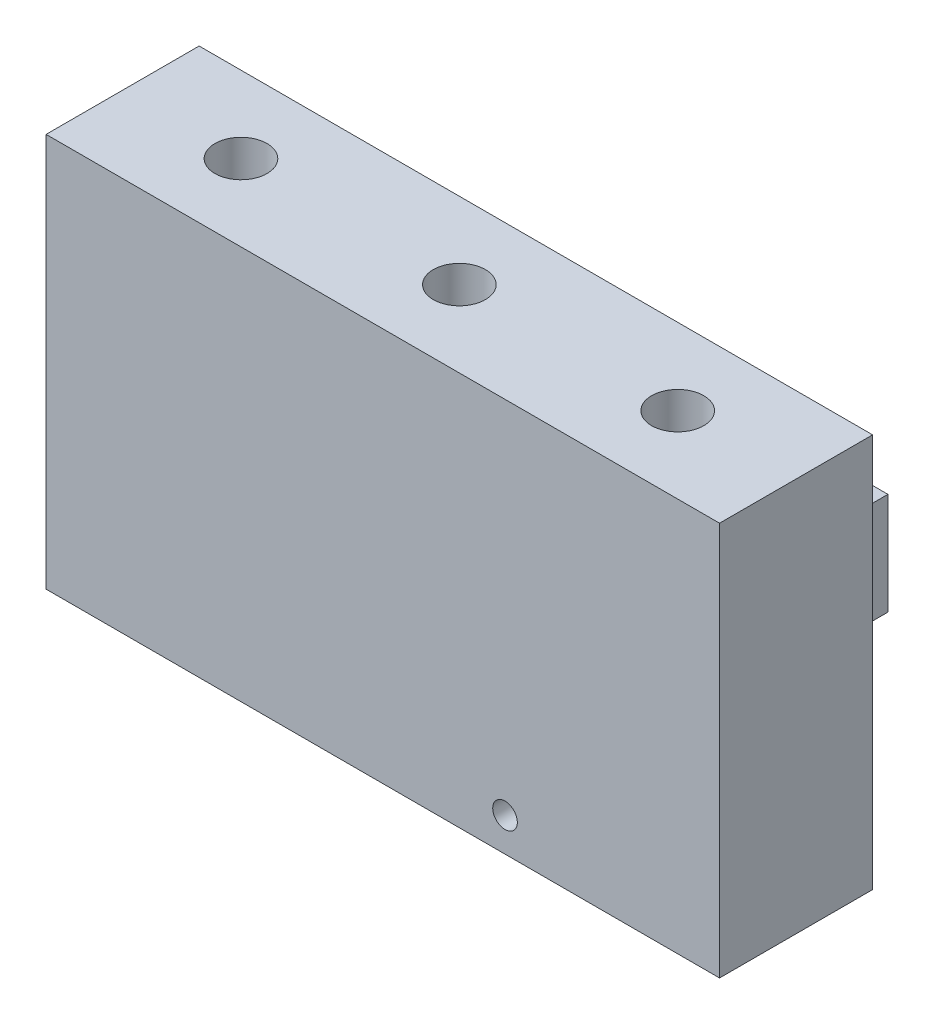
ISO-10303-21;
HEADER;
FILE_DESCRIPTION(('STEP AP214'),'2;1');
FILE_NAME('part.step','',(''),(''),'','','');
FILE_SCHEMA(('AUTOMOTIVE_DESIGN { 1 0 10303 214 1 1 1 1 }'));
ENDSEC;
DATA;
#1=APPLICATION_CONTEXT('core data for automotive mechanical design processes');
#2=APPLICATION_PROTOCOL_DEFINITION('international standard','automotive_design',2000,#1);
#3=PRODUCT_CONTEXT('',#1,'mechanical');
#4=PRODUCT('Part','Part','',(#3));
#5=PRODUCT_RELATED_PRODUCT_CATEGORY('part','',(#4));
#6=PRODUCT_DEFINITION_FORMATION('','',#4);
#7=PRODUCT_DEFINITION_CONTEXT('part definition',#1,'design');
#8=PRODUCT_DEFINITION('design','',#6,#7);
#9=PRODUCT_DEFINITION_SHAPE('','',#8);
#10=(LENGTH_UNIT() NAMED_UNIT(*) SI_UNIT(.MILLI.,.METRE.));
#11=(NAMED_UNIT(*) PLANE_ANGLE_UNIT() SI_UNIT($,.RADIAN.));
#12=(NAMED_UNIT(*) SI_UNIT($,.STERADIAN.) SOLID_ANGLE_UNIT());
#13=UNCERTAINTY_MEASURE_WITH_UNIT(LENGTH_MEASURE(1.E-05),#10,'distance_accuracy_value','');
#14=(GEOMETRIC_REPRESENTATION_CONTEXT(3) GLOBAL_UNCERTAINTY_ASSIGNED_CONTEXT((#13)) GLOBAL_UNIT_ASSIGNED_CONTEXT((#10,
#11,#12)) REPRESENTATION_CONTEXT('',''));
#15=CARTESIAN_POINT('',(0.,0.,0.));
#16=DIRECTION('',(0.,0.,1.));
#17=DIRECTION('',(1.,0.,0.));
#18=AXIS2_PLACEMENT_3D('',#15,#16,#17);
#19=CARTESIAN_POINT('',(24.5,10.,0.));
#20=DIRECTION('',(-1.,0.,0.));
#21=DIRECTION('',(0.,0.,-1.));
#22=AXIS2_PLACEMENT_3D('',#19,#20,#21);
#23=PLANE('',#22);
#24=DIRECTION('',(0.,0.,1.));
#25=VECTOR('',#24,1.);
#26=CARTESIAN_POINT('',(24.5,0.,0.));
#27=LINE('',#26,#25);
#28=CARTESIAN_POINT('',(24.5,0.,0.));
#29=VERTEX_POINT('',#28);
#30=CARTESIAN_POINT('',(24.5,0.,10.));
#31=VERTEX_POINT('',#30);
#32=EDGE_CURVE('E149',#29,#31,#27,.T.);
#33=ORIENTED_EDGE('',*,*,#32,.F.);
#34=DIRECTION('',(0.,-1.,0.));
#35=VECTOR('',#34,1.);
#36=CARTESIAN_POINT('',(24.5,10.,0.));
#37=LINE('',#36,#35);
#38=CARTESIAN_POINT('',(24.5,10.,0.));
#39=VERTEX_POINT('',#38);
#40=EDGE_CURVE('E177',#39,#29,#37,.T.);
#41=ORIENTED_EDGE('',*,*,#40,.F.);
#42=DIRECTION('',(0.,0.,1.));
#43=VECTOR('',#42,1.);
#44=CARTESIAN_POINT('',(24.5,10.,0.));
#45=LINE('',#44,#43);
#46=CARTESIAN_POINT('',(24.5,10.,10.));
#47=VERTEX_POINT('',#46);
#48=EDGE_CURVE('E170',#39,#47,#45,.T.);
#49=ORIENTED_EDGE('',*,*,#48,.T.);
#50=DIRECTION('',(0.,-1.,0.));
#51=VECTOR('',#50,1.);
#52=CARTESIAN_POINT('',(24.5,10.,10.));
#53=LINE('',#52,#51);
#54=EDGE_CURVE('E11',#47,#31,#53,.T.);
#55=ORIENTED_EDGE('',*,*,#54,.T.);
#56=EDGE_LOOP('',(#33,#41,#49,#55));
#57=FACE_BOUND('',#56,.T.);
#58=ADVANCED_FACE('F37',(#57),#23,.F.);
#59=CARTESIAN_POINT('',(-24.5,10.,0.));
#60=DIRECTION('',(-1.,0.,0.));
#61=DIRECTION('',(0.,0.,-1.));
#62=AXIS2_PLACEMENT_3D('',#59,#60,#61);
#63=PLANE('',#62);
#64=DIRECTION('',(0.,0.,1.));
#65=VECTOR('',#64,1.);
#66=CARTESIAN_POINT('',(-24.5,0.,0.));
#67=LINE('',#66,#65);
#68=CARTESIAN_POINT('',(-24.5,0.,0.));
#69=VERTEX_POINT('',#68);
#70=CARTESIAN_POINT('',(-24.5,0.,10.));
#71=VERTEX_POINT('',#70);
#72=EDGE_CURVE('E181',#69,#71,#67,.T.);
#73=ORIENTED_EDGE('',*,*,#72,.T.);
#74=DIRECTION('',(0.,-1.,0.));
#75=VECTOR('',#74,1.);
#76=CARTESIAN_POINT('',(-24.5,10.,10.));
#77=LINE('',#76,#75);
#78=CARTESIAN_POINT('',(-24.5,10.,10.));
#79=VERTEX_POINT('',#78);
#80=EDGE_CURVE('E46',#79,#71,#77,.T.);
#81=ORIENTED_EDGE('',*,*,#80,.F.);
#82=DIRECTION('',(0.,0.,1.));
#83=VECTOR('',#82,1.);
#84=CARTESIAN_POINT('',(-24.5,10.,0.));
#85=LINE('',#84,#83);
#86=CARTESIAN_POINT('',(-24.5,10.,0.));
#87=VERTEX_POINT('',#86);
#88=EDGE_CURVE('E174',#87,#79,#85,.T.);
#89=ORIENTED_EDGE('',*,*,#88,.F.);
#90=DIRECTION('',(0.,-1.,0.));
#91=VECTOR('',#90,1.);
#92=CARTESIAN_POINT('',(-24.5,10.,0.));
#93=LINE('',#92,#91);
#94=EDGE_CURVE('E186',#87,#69,#93,.T.);
#95=ORIENTED_EDGE('',*,*,#94,.T.);
#96=EDGE_LOOP('',(#73,#81,#89,#95));
#97=FACE_BOUND('',#96,.T.);
#98=ADVANCED_FACE('F195',(#97),#63,.T.);
#99=CARTESIAN_POINT('',(24.5,10.,0.));
#100=DIRECTION('',(0.,0.,-1.));
#101=DIRECTION('',(1.,0.,0.));
#102=AXIS2_PLACEMENT_3D('',#99,#100,#101);
#103=PLANE('',#102);
#104=DIRECTION('',(-1.,0.,0.));
#105=VECTOR('',#104,1.);
#106=CARTESIAN_POINT('',(24.5,0.,0.));
#107=LINE('',#106,#105);
#108=EDGE_CURVE('E66',#29,#69,#107,.T.);
#109=ORIENTED_EDGE('',*,*,#108,.T.);
#110=ORIENTED_EDGE('',*,*,#94,.F.);
#111=DIRECTION('',(-1.,0.,0.));
#112=VECTOR('',#111,1.);
#113=CARTESIAN_POINT('',(24.5,10.,0.));
#114=LINE('',#113,#112);
#115=EDGE_CURVE('E54',#39,#87,#114,.T.);
#116=ORIENTED_EDGE('',*,*,#115,.F.);
#117=ORIENTED_EDGE('',*,*,#40,.T.);
#118=EDGE_LOOP('',(#109,#110,#116,#117));
#119=FACE_BOUND('',#118,.T.);
#120=ADVANCED_FACE('F201',(#119),#103,.T.);
#121=CARTESIAN_POINT('',(0.,10.,0.));
#122=DIRECTION('',(0.,-1.,0.));
#123=DIRECTION('',(0.,0.,1.));
#124=AXIS2_PLACEMENT_3D('',#121,#122,#123);
#125=PLANE('',#124);
#126=CARTESIAN_POINT('',(-18.75,10.,5.));
#127=DIRECTION('',(0.,-1.,0.));
#128=DIRECTION('',(0.,0.,-1.));
#129=AXIS2_PLACEMENT_3D('',#126,#127,#128);
#130=CIRCLE('',#129,2.75);
#131=CARTESIAN_POINT('',(-18.75,10.,2.25));
#132=VERTEX_POINT('',#131);
#133=EDGE_CURVE('E150',#132,#132,#130,.T.);
#134=ORIENTED_EDGE('',*,*,#133,.T.);
#135=EDGE_LOOP('',(#134));
#136=FACE_BOUND('',#135,.T.);
#137=CARTESIAN_POINT('',(-6.25,10.,5.));
#138=DIRECTION('',(0.,-1.,0.));
#139=DIRECTION('',(0.,0.,-1.));
#140=AXIS2_PLACEMENT_3D('',#137,#138,#139);
#141=CIRCLE('',#140,2.75);
#142=CARTESIAN_POINT('',(-6.25,10.,2.25));
#143=VERTEX_POINT('',#142);
#144=EDGE_CURVE('E156',#143,#143,#141,.T.);
#145=ORIENTED_EDGE('',*,*,#144,.T.);
#146=EDGE_LOOP('',(#145));
#147=FACE_BOUND('',#146,.T.);
#148=CARTESIAN_POINT('',(6.25,10.,5.));
#149=DIRECTION('',(0.,-1.,0.));
#150=DIRECTION('',(0.,0.,-1.));
#151=AXIS2_PLACEMENT_3D('',#148,#149,#150);
#152=CIRCLE('',#151,2.75);
#153=CARTESIAN_POINT('',(6.25,10.,2.25));
#154=VERTEX_POINT('',#153);
#155=EDGE_CURVE('E162',#154,#154,#152,.T.);
#156=ORIENTED_EDGE('',*,*,#155,.T.);
#157=EDGE_LOOP('',(#156));
#158=FACE_BOUND('',#157,.T.);
#159=CARTESIAN_POINT('',(18.75,10.,5.));
#160=DIRECTION('',(0.,-1.,0.));
#161=DIRECTION('',(0.,0.,-1.));
#162=AXIS2_PLACEMENT_3D('',#159,#160,#161);
#163=CIRCLE('',#162,2.75);
#164=CARTESIAN_POINT('',(18.75,10.,2.25));
#165=VERTEX_POINT('',#164);
#166=EDGE_CURVE('E135',#165,#165,#163,.T.);
#167=ORIENTED_EDGE('',*,*,#166,.T.);
#168=EDGE_LOOP('',(#167));
#169=FACE_BOUND('',#168,.T.);
#170=ORIENTED_EDGE('',*,*,#48,.F.);
#171=ORIENTED_EDGE('',*,*,#115,.T.);
#172=ORIENTED_EDGE('',*,*,#88,.T.);
#173=DIRECTION('',(1.,0.,0.));
#174=VECTOR('',#173,1.);
#175=CARTESIAN_POINT('',(-24.5,10.,10.));
#176=LINE('',#175,#174);
#177=EDGE_CURVE('E77',#79,#47,#176,.T.);
#178=ORIENTED_EDGE('',*,*,#177,.T.);
#179=EDGE_LOOP('',(#170,#171,#172,#178));
#180=FACE_BOUND('',#179,.T.);
#181=ADVANCED_FACE('F200',(#136,#147,#158,#169,#180),#125,.F.);
#182=CARTESIAN_POINT('',(0.,0.,0.));
#183=DIRECTION('',(0.,-1.,0.));
#184=DIRECTION('',(0.,0.,1.));
#185=AXIS2_PLACEMENT_3D('',#182,#183,#184);
#186=PLANE('',#185);
#187=CARTESIAN_POINT('',(-18.75,0.,5.));
#188=DIRECTION('',(0.,-1.,0.));
#189=DIRECTION('',(0.,0.,-1.));
#190=AXIS2_PLACEMENT_3D('',#187,#188,#189);
#191=CIRCLE('',#190,2.75);
#192=CARTESIAN_POINT('',(-18.75,0.,2.25));
#193=VERTEX_POINT('',#192);
#194=EDGE_CURVE('E146',#193,#193,#191,.T.);
#195=ORIENTED_EDGE('',*,*,#194,.F.);
#196=EDGE_LOOP('',(#195));
#197=FACE_BOUND('',#196,.T.);
#198=CARTESIAN_POINT('',(-6.25,0.,5.));
#199=DIRECTION('',(0.,-1.,0.));
#200=DIRECTION('',(0.,0.,-1.));
#201=AXIS2_PLACEMENT_3D('',#198,#199,#200);
#202=CIRCLE('',#201,2.75);
#203=CARTESIAN_POINT('',(-6.25,0.,2.25));
#204=VERTEX_POINT('',#203);
#205=EDGE_CURVE('E153',#204,#204,#202,.T.);
#206=ORIENTED_EDGE('',*,*,#205,.F.);
#207=EDGE_LOOP('',(#206));
#208=FACE_BOUND('',#207,.T.);
#209=CARTESIAN_POINT('',(6.25,0.,5.));
#210=DIRECTION('',(0.,-1.,0.));
#211=DIRECTION('',(0.,0.,-1.));
#212=AXIS2_PLACEMENT_3D('',#209,#210,#211);
#213=CIRCLE('',#212,2.75);
#214=CARTESIAN_POINT('',(6.25,0.,2.25));
#215=VERTEX_POINT('',#214);
#216=EDGE_CURVE('E159',#215,#215,#213,.T.);
#217=ORIENTED_EDGE('',*,*,#216,.F.);
#218=EDGE_LOOP('',(#217));
#219=FACE_BOUND('',#218,.T.);
#220=CARTESIAN_POINT('',(18.75,0.,5.));
#221=DIRECTION('',(0.,-1.,0.));
#222=DIRECTION('',(0.,0.,-1.));
#223=AXIS2_PLACEMENT_3D('',#220,#221,#222);
#224=CIRCLE('',#223,2.75);
#225=CARTESIAN_POINT('',(18.75,0.,2.25));
#226=VERTEX_POINT('',#225);
#227=EDGE_CURVE('E165',#226,#226,#224,.T.);
#228=ORIENTED_EDGE('',*,*,#227,.F.);
#229=EDGE_LOOP('',(#228));
#230=FACE_BOUND('',#229,.T.);
#231=ORIENTED_EDGE('',*,*,#32,.T.);
#232=DIRECTION('',(1.,0.,0.));
#233=VECTOR('',#232,1.);
#234=CARTESIAN_POINT('',(-24.5,0.,10.));
#235=LINE('',#234,#233);
#236=EDGE_CURVE('E179',#71,#31,#235,.T.);
#237=ORIENTED_EDGE('',*,*,#236,.F.);
#238=ORIENTED_EDGE('',*,*,#72,.F.);
#239=ORIENTED_EDGE('',*,*,#108,.F.);
#240=EDGE_LOOP('',(#231,#237,#238,#239));
#241=FACE_BOUND('',#240,.T.);
#242=ADVANCED_FACE('F196',(#197,#208,#219,#230,#241),#186,.T.);
#243=CARTESIAN_POINT('',(18.75,0.,5.));
#244=DIRECTION('',(0.,1.,0.));
#245=DIRECTION('',(0.,0.,-1.));
#246=AXIS2_PLACEMENT_3D('',#243,#244,#245);
#247=CYLINDRICAL_SURFACE('',#246,2.75);
#248=ORIENTED_EDGE('',*,*,#227,.T.);
#249=EDGE_LOOP('',(#248));
#250=FACE_BOUND('',#249,.T.);
#251=ORIENTED_EDGE('',*,*,#166,.F.);
#252=EDGE_LOOP('',(#251));
#253=FACE_BOUND('',#252,.T.);
#254=ADVANCED_FACE('F237',(#250,#253),#247,.F.);
#255=CARTESIAN_POINT('',(6.25,0.,5.));
#256=DIRECTION('',(0.,1.,0.));
#257=DIRECTION('',(0.,0.,-1.));
#258=AXIS2_PLACEMENT_3D('',#255,#256,#257);
#259=CYLINDRICAL_SURFACE('',#258,2.75);
#260=ORIENTED_EDGE('',*,*,#216,.T.);
#261=EDGE_LOOP('',(#260));
#262=FACE_BOUND('',#261,.T.);
#263=ORIENTED_EDGE('',*,*,#155,.F.);
#264=EDGE_LOOP('',(#263));
#265=FACE_BOUND('',#264,.T.);
#266=ADVANCED_FACE('F246',(#262,#265),#259,.F.);
#267=CARTESIAN_POINT('',(-6.25,0.,5.));
#268=DIRECTION('',(0.,1.,0.));
#269=DIRECTION('',(0.,0.,-1.));
#270=AXIS2_PLACEMENT_3D('',#267,#268,#269);
#271=CYLINDRICAL_SURFACE('',#270,2.75);
#272=ORIENTED_EDGE('',*,*,#205,.T.);
#273=EDGE_LOOP('',(#272));
#274=FACE_BOUND('',#273,.T.);
#275=ORIENTED_EDGE('',*,*,#144,.F.);
#276=EDGE_LOOP('',(#275));
#277=FACE_BOUND('',#276,.T.);
#278=ADVANCED_FACE('F256',(#274,#277),#271,.F.);
#279=CARTESIAN_POINT('',(-18.75,0.,5.));
#280=DIRECTION('',(0.,1.,0.));
#281=DIRECTION('',(0.,0.,-1.));
#282=AXIS2_PLACEMENT_3D('',#279,#280,#281);
#283=CYLINDRICAL_SURFACE('',#282,2.75);
#284=ORIENTED_EDGE('',*,*,#194,.T.);
#285=EDGE_LOOP('',(#284));
#286=FACE_BOUND('',#285,.T.);
#287=ORIENTED_EDGE('',*,*,#133,.F.);
#288=EDGE_LOOP('',(#287));
#289=FACE_BOUND('',#288,.T.);
#290=ADVANCED_FACE('F266',(#286,#289),#283,.F.);
#291=CARTESIAN_POINT('',(-33.,0.,25.));
#292=DIRECTION('',(-1.,0.,0.));
#293=DIRECTION('',(0.,0.,-1.));
#294=AXIS2_PLACEMENT_3D('',#291,#292,#293);
#295=PLANE('',#294);
#296=DIRECTION('',(0.,-1.,0.));
#297=VECTOR('',#296,1.);
#298=CARTESIAN_POINT('',(-33.,0.,10.));
#299=LINE('',#298,#297);
#300=CARTESIAN_POINT('',(-33.,24.2999999988159,10.));
#301=VERTEX_POINT('',#300);
#302=CARTESIAN_POINT('',(-33.,-14.3000000011841,10.));
#303=VERTEX_POINT('',#302);
#304=EDGE_CURVE('E138',#301,#303,#299,.T.);
#305=ORIENTED_EDGE('',*,*,#304,.T.);
#306=DIRECTION('',(0.,0.,1.));
#307=VECTOR('',#306,1.);
#308=CARTESIAN_POINT('',(-33.,-14.3000000011841,-56.349378294119));
#309=LINE('',#308,#307);
#310=CARTESIAN_POINT('',(-33.,-14.3000000011841,25.));
#311=VERTEX_POINT('',#310);
#312=EDGE_CURVE('E132',#303,#311,#309,.T.);
#313=ORIENTED_EDGE('',*,*,#312,.T.);
#314=DIRECTION('',(0.,-1.,0.));
#315=VECTOR('',#314,1.);
#316=CARTESIAN_POINT('',(-33.,0.,25.));
#317=LINE('',#316,#315);
#318=CARTESIAN_POINT('',(-33.,24.2999999988159,25.));
#319=VERTEX_POINT('',#318);
#320=EDGE_CURVE('E112',#319,#311,#317,.T.);
#321=ORIENTED_EDGE('',*,*,#320,.F.);
#322=DIRECTION('',(0.,0.,1.));
#323=VECTOR('',#322,1.);
#324=CARTESIAN_POINT('',(-33.,24.2999999988159,-56.349378294119));
#325=LINE('',#324,#323);
#326=EDGE_CURVE('E119',#301,#319,#325,.T.);
#327=ORIENTED_EDGE('',*,*,#326,.F.);
#328=EDGE_LOOP('',(#305,#313,#321,#327));
#329=FACE_BOUND('',#328,.T.);
#330=ADVANCED_FACE('F130',(#329),#295,.T.);
#331=CARTESIAN_POINT('',(33.,0.,25.));
#332=DIRECTION('',(-1.,0.,0.));
#333=DIRECTION('',(0.,0.,-1.));
#334=AXIS2_PLACEMENT_3D('',#331,#332,#333);
#335=PLANE('',#334);
#336=DIRECTION('',(0.,-1.,0.));
#337=VECTOR('',#336,1.);
#338=CARTESIAN_POINT('',(33.,0.,10.));
#339=LINE('',#338,#337);
#340=CARTESIAN_POINT('',(33.,24.2999999988159,10.));
#341=VERTEX_POINT('',#340);
#342=CARTESIAN_POINT('',(33.,-14.3000000011841,10.));
#343=VERTEX_POINT('',#342);
#344=EDGE_CURVE('E133',#341,#343,#339,.T.);
#345=ORIENTED_EDGE('',*,*,#344,.F.);
#346=DIRECTION('',(0.,0.,1.));
#347=VECTOR('',#346,1.);
#348=CARTESIAN_POINT('',(33.,24.2999999988159,-56.349378294119));
#349=LINE('',#348,#347);
#350=CARTESIAN_POINT('',(33.,24.2999999988159,25.));
#351=VERTEX_POINT('',#350);
#352=EDGE_CURVE('E128',#341,#351,#349,.T.);
#353=ORIENTED_EDGE('',*,*,#352,.T.);
#354=DIRECTION('',(0.,-1.,0.));
#355=VECTOR('',#354,1.);
#356=CARTESIAN_POINT('',(33.,0.,25.));
#357=LINE('',#356,#355);
#358=CARTESIAN_POINT('',(33.,-14.3000000011841,25.));
#359=VERTEX_POINT('',#358);
#360=EDGE_CURVE('E115',#351,#359,#357,.T.);
#361=ORIENTED_EDGE('',*,*,#360,.T.);
#362=DIRECTION('',(0.,0.,1.));
#363=VECTOR('',#362,1.);
#364=CARTESIAN_POINT('',(33.,-14.3000000011841,-56.349378294119));
#365=LINE('',#364,#363);
#366=EDGE_CURVE('E141',#343,#359,#365,.T.);
#367=ORIENTED_EDGE('',*,*,#366,.F.);
#368=EDGE_LOOP('',(#345,#353,#361,#367));
#369=FACE_BOUND('',#368,.T.);
#370=ADVANCED_FACE('F286',(#369),#335,.F.);
#371=CARTESIAN_POINT('',(0.,0.,25.));
#372=DIRECTION('',(0.,0.,1.));
#373=DIRECTION('',(-1.,0.,0.));
#374=AXIS2_PLACEMENT_3D('',#371,#372,#373);
#375=PLANE('',#374);
#376=CARTESIAN_POINT('',(11.9760999998328,-11.0000000010083,25.));
#377=DIRECTION('',(0.,0.,-1.));
#378=DIRECTION('',(-1.,0.,0.));
#379=AXIS2_PLACEMENT_3D('',#376,#377,#378);
#380=ELLIPSE('',#379,1.2065,1.20586704213638);
#381=CARTESIAN_POINT('',(10.7695999998328,-11.0000000010083,25.));
#382=VERTEX_POINT('',#381);
#383=EDGE_CURVE('E392',#382,#382,#380,.T.);
#384=ORIENTED_EDGE('',*,*,#383,.T.);
#385=EDGE_LOOP('',(#384));
#386=FACE_BOUND('',#385,.T.);
#387=ORIENTED_EDGE('',*,*,#360,.F.);
#388=DIRECTION('',(-1.,0.,0.));
#389=VECTOR('',#388,1.);
#390=CARTESIAN_POINT('',(0.,24.2999999988159,25.));
#391=LINE('',#390,#389);
#392=EDGE_CURVE('E108',#351,#319,#391,.T.);
#393=ORIENTED_EDGE('',*,*,#392,.T.);
#394=ORIENTED_EDGE('',*,*,#320,.T.);
#395=DIRECTION('',(1.,0.,0.));
#396=VECTOR('',#395,1.);
#397=CARTESIAN_POINT('',(0.,-14.3000000011841,25.));
#398=LINE('',#397,#396);
#399=EDGE_CURVE('E412',#311,#359,#398,.T.);
#400=ORIENTED_EDGE('',*,*,#399,.T.);
#401=EDGE_LOOP('',(#387,#393,#394,#400));
#402=FACE_BOUND('',#401,.T.);
#403=ADVANCED_FACE('F110',(#386,#402),#375,.T.);
#404=CARTESIAN_POINT('',(0.,0.,10.));
#405=DIRECTION('',(0.,0.,1.));
#406=DIRECTION('',(-1.,0.,0.));
#407=AXIS2_PLACEMENT_3D('',#404,#405,#406);
#408=PLANE('',#407);
#409=CARTESIAN_POINT('',(11.9760999998328,-11.0000000010083,10.));
#410=DIRECTION('',(0.,0.,-1.));
#411=DIRECTION('',(-1.,0.,0.));
#412=AXIS2_PLACEMENT_3D('',#409,#410,#411);
#413=ELLIPSE('',#412,1.2065,1.20586704213638);
#414=CARTESIAN_POINT('',(10.7695999998328,-11.0000000010083,10.));
#415=VERTEX_POINT('',#414);
#416=EDGE_CURVE('E40',#415,#415,#413,.T.);
#417=ORIENTED_EDGE('',*,*,#416,.F.);
#418=EDGE_LOOP('',(#417));
#419=FACE_BOUND('',#418,.T.);
#420=ORIENTED_EDGE('',*,*,#236,.T.);
#421=ORIENTED_EDGE('',*,*,#54,.F.);
#422=ORIENTED_EDGE('',*,*,#177,.F.);
#423=ORIENTED_EDGE('',*,*,#80,.T.);
#424=EDGE_LOOP('',(#420,#421,#422,#423));
#425=FACE_BOUND('',#424,.T.);
#426=ORIENTED_EDGE('',*,*,#304,.F.);
#427=DIRECTION('',(1.,0.,0.));
#428=VECTOR('',#427,1.);
#429=CARTESIAN_POINT('',(0.,24.2999999988159,10.));
#430=LINE('',#429,#428);
#431=EDGE_CURVE('E124',#301,#341,#430,.T.);
#432=ORIENTED_EDGE('',*,*,#431,.T.);
#433=ORIENTED_EDGE('',*,*,#344,.T.);
#434=DIRECTION('',(-1.,0.,0.));
#435=VECTOR('',#434,1.);
#436=CARTESIAN_POINT('',(0.,-14.3000000011841,10.));
#437=LINE('',#436,#435);
#438=EDGE_CURVE('E144',#343,#303,#437,.T.);
#439=ORIENTED_EDGE('',*,*,#438,.T.);
#440=EDGE_LOOP('',(#426,#432,#433,#439));
#441=FACE_BOUND('',#440,.T.);
#442=ADVANCED_FACE('F191',(#419,#425,#441),#408,.F.);
#443=CARTESIAN_POINT('',(0.,-14.3000000011841,-56.349378294119));
#444=DIRECTION('',(0.,1.,0.));
#445=DIRECTION('',(-1.,0.,0.));
#446=AXIS2_PLACEMENT_3D('',#443,#444,#445);
#447=PLANE('',#446);
#448=CARTESIAN_POINT('',(-21.4,-14.3000000011841,17.5));
#449=DIRECTION('',(0.,1.,0.));
#450=DIRECTION('',(0.,0.,1.));
#451=AXIS2_PLACEMENT_3D('',#448,#449,#450);
#452=CIRCLE('',#451,2.55269999999999);
#453=CARTESIAN_POINT('',(-21.4,-14.3000000011841,20.0527));
#454=VERTEX_POINT('',#453);
#455=EDGE_CURVE('E395',#454,#454,#452,.T.);
#456=ORIENTED_EDGE('',*,*,#455,.T.);
#457=EDGE_LOOP('',(#456));
#458=FACE_BOUND('',#457,.T.);
#459=CARTESIAN_POINT('',(21.4,-14.3000000011841,17.5));
#460=DIRECTION('',(0.,1.,0.));
#461=DIRECTION('',(0.,0.,1.));
#462=AXIS2_PLACEMENT_3D('',#459,#460,#461);
#463=CIRCLE('',#462,2.55269999999999);
#464=CARTESIAN_POINT('',(21.4,-14.3000000011841,20.0527));
#465=VERTEX_POINT('',#464);
#466=EDGE_CURVE('E401',#465,#465,#463,.T.);
#467=ORIENTED_EDGE('',*,*,#466,.T.);
#468=EDGE_LOOP('',(#467));
#469=FACE_BOUND('',#468,.T.);
#470=CARTESIAN_POINT('',(0.,-14.3000000011841,17.5));
#471=DIRECTION('',(0.,1.,0.));
#472=DIRECTION('',(0.,0.,1.));
#473=AXIS2_PLACEMENT_3D('',#470,#471,#472);
#474=CIRCLE('',#473,2.5527);
#475=CARTESIAN_POINT('',(0.,-14.3000000011841,20.0527));
#476=VERTEX_POINT('',#475);
#477=EDGE_CURVE('E407',#476,#476,#474,.T.);
#478=ORIENTED_EDGE('',*,*,#477,.T.);
#479=EDGE_LOOP('',(#478));
#480=FACE_BOUND('',#479,.T.);
#481=ORIENTED_EDGE('',*,*,#366,.T.);
#482=ORIENTED_EDGE('',*,*,#399,.F.);
#483=ORIENTED_EDGE('',*,*,#312,.F.);
#484=ORIENTED_EDGE('',*,*,#438,.F.);
#485=EDGE_LOOP('',(#481,#482,#483,#484));
#486=FACE_BOUND('',#485,.T.);
#487=ADVANCED_FACE('F319',(#458,#469,#480,#486),#447,.F.);
#488=CARTESIAN_POINT('',(0.,24.2999999988159,-56.349378294119));
#489=DIRECTION('',(0.,-1.,0.));
#490=DIRECTION('',(1.,0.,0.));
#491=AXIS2_PLACEMENT_3D('',#488,#489,#490);
#492=PLANE('',#491);
#493=CARTESIAN_POINT('',(-21.4,24.2999999988159,17.5));
#494=DIRECTION('',(0.,1.,0.));
#495=DIRECTION('',(0.,0.,1.));
#496=AXIS2_PLACEMENT_3D('',#493,#494,#495);
#497=CIRCLE('',#496,2.55269999999999);
#498=CARTESIAN_POINT('',(-21.4,24.2999999988159,20.0527));
#499=VERTEX_POINT('',#498);
#500=EDGE_CURVE('E398',#499,#499,#497,.T.);
#501=ORIENTED_EDGE('',*,*,#500,.F.);
#502=EDGE_LOOP('',(#501));
#503=FACE_BOUND('',#502,.T.);
#504=CARTESIAN_POINT('',(21.4,24.2999999988159,17.5));
#505=DIRECTION('',(0.,1.,0.));
#506=DIRECTION('',(0.,0.,1.));
#507=AXIS2_PLACEMENT_3D('',#504,#505,#506);
#508=CIRCLE('',#507,2.55269999999999);
#509=CARTESIAN_POINT('',(21.4,24.2999999988159,20.0527));
#510=VERTEX_POINT('',#509);
#511=EDGE_CURVE('E404',#510,#510,#508,.T.);
#512=ORIENTED_EDGE('',*,*,#511,.F.);
#513=EDGE_LOOP('',(#512));
#514=FACE_BOUND('',#513,.T.);
#515=CARTESIAN_POINT('',(0.,24.2999999988159,17.5));
#516=DIRECTION('',(0.,1.,0.));
#517=DIRECTION('',(0.,0.,1.));
#518=AXIS2_PLACEMENT_3D('',#515,#516,#517);
#519=CIRCLE('',#518,2.55269999999999);
#520=CARTESIAN_POINT('',(0.,24.2999999988159,20.0527));
#521=VERTEX_POINT('',#520);
#522=EDGE_CURVE('E120',#521,#521,#519,.T.);
#523=ORIENTED_EDGE('',*,*,#522,.F.);
#524=EDGE_LOOP('',(#523));
#525=FACE_BOUND('',#524,.T.);
#526=ORIENTED_EDGE('',*,*,#326,.T.);
#527=ORIENTED_EDGE('',*,*,#392,.F.);
#528=ORIENTED_EDGE('',*,*,#352,.F.);
#529=ORIENTED_EDGE('',*,*,#431,.F.);
#530=EDGE_LOOP('',(#526,#527,#528,#529));
#531=FACE_BOUND('',#530,.T.);
#532=ADVANCED_FACE('F123',(#503,#514,#525,#531),#492,.F.);
#533=CARTESIAN_POINT('',(0.,-14.3000000011841,17.5));
#534=DIRECTION('',(0.,-1.,0.));
#535=DIRECTION('',(0.,0.,1.));
#536=AXIS2_PLACEMENT_3D('',#533,#534,#535);
#537=CYLINDRICAL_SURFACE('',#536,2.55269999999999);
#538=ORIENTED_EDGE('',*,*,#522,.T.);
#539=EDGE_LOOP('',(#538));
#540=FACE_BOUND('',#539,.T.);
#541=ORIENTED_EDGE('',*,*,#477,.F.);
#542=EDGE_LOOP('',(#541));
#543=FACE_BOUND('',#542,.T.);
#544=ADVANCED_FACE('F342',(#540,#543),#537,.F.);
#545=CARTESIAN_POINT('',(21.4,-14.3000000011841,17.5));
#546=DIRECTION('',(0.,-1.,0.));
#547=DIRECTION('',(0.,0.,1.));
#548=AXIS2_PLACEMENT_3D('',#545,#546,#547);
#549=CYLINDRICAL_SURFACE('',#548,2.55269999999999);
#550=ORIENTED_EDGE('',*,*,#511,.T.);
#551=EDGE_LOOP('',(#550));
#552=FACE_BOUND('',#551,.T.);
#553=ORIENTED_EDGE('',*,*,#466,.F.);
#554=EDGE_LOOP('',(#553));
#555=FACE_BOUND('',#554,.T.);
#556=ADVANCED_FACE('F353',(#552,#555),#549,.F.);
#557=CARTESIAN_POINT('',(-21.4,-14.3000000011841,17.5));
#558=DIRECTION('',(0.,-1.,0.));
#559=DIRECTION('',(0.,0.,1.));
#560=AXIS2_PLACEMENT_3D('',#557,#558,#559);
#561=CYLINDRICAL_SURFACE('',#560,2.55269999999999);
#562=ORIENTED_EDGE('',*,*,#500,.T.);
#563=EDGE_LOOP('',(#562));
#564=FACE_BOUND('',#563,.T.);
#565=ORIENTED_EDGE('',*,*,#455,.F.);
#566=EDGE_LOOP('',(#565));
#567=FACE_BOUND('',#566,.T.);
#568=ADVANCED_FACE('F363',(#564,#567),#561,.F.);
#569=CARTESIAN_POINT('',(11.9760999998328,-11.0000000010083,0.));
#570=DIRECTION('',(0.,0.,-1.));
#571=DIRECTION('',(-1.,0.,0.));
#572=AXIS2_PLACEMENT_3D('',#569,#570,#571);
#573=ELLIPSE('',#572,1.2065,1.20586704213638);
#574=DIRECTION('',(0.,0.,1.));
#575=VECTOR('',#574,1.);
#576=SURFACE_OF_LINEAR_EXTRUSION('',#573,#575);
#577=ORIENTED_EDGE('',*,*,#383,.F.);
#578=EDGE_LOOP('',(#577));
#579=FACE_BOUND('',#578,.T.);
#580=ORIENTED_EDGE('',*,*,#416,.T.);
#581=EDGE_LOOP('',(#580));
#582=FACE_BOUND('',#581,.T.);
#583=ADVANCED_FACE('F373',(#579,#582),#576,.T.);
#584=CLOSED_SHELL('',(#58,#98,#120,#181,#242,#254,#266,#278,#290,#330,#370,#403,#442,#487,#532,
#544,#556,#568,#583));
#585=MANIFOLD_SOLID_BREP('B2',#584);
#586=ADVANCED_BREP_SHAPE_REPRESENTATION('',(#18,#585),#14);
#587=SHAPE_DEFINITION_REPRESENTATION(#9,#586);
ENDSEC;
END-ISO-10303-21;
